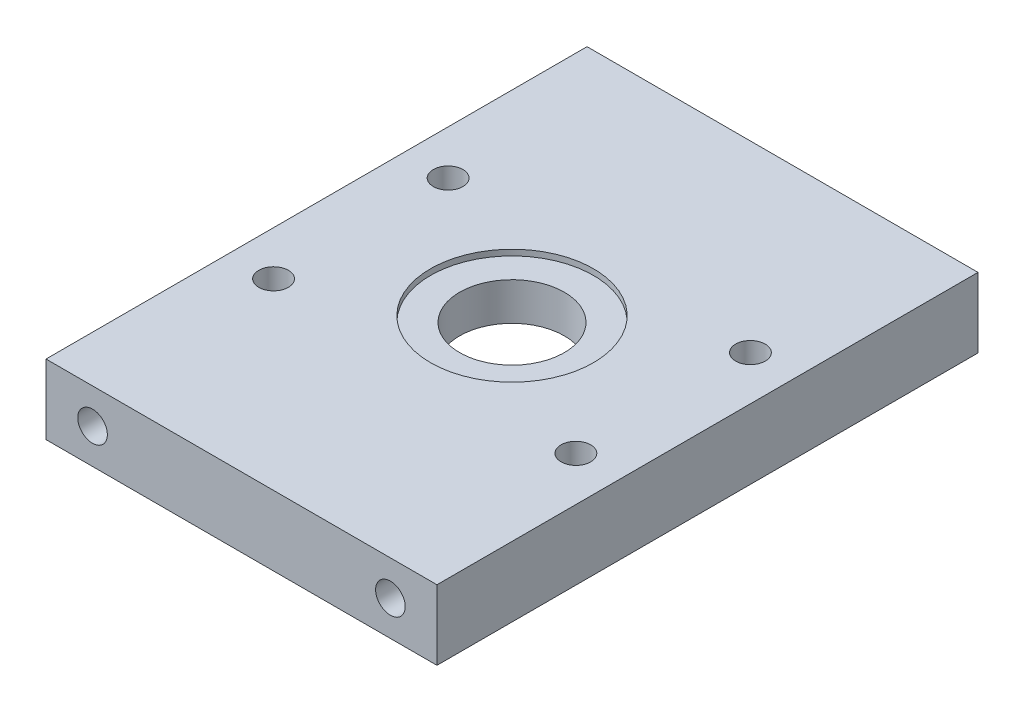
ISO-10303-21;
HEADER;
FILE_DESCRIPTION(('STEP AP214'),'2;1');
FILE_NAME('part.step','',(''),(''),'','','');
FILE_SCHEMA(('AUTOMOTIVE_DESIGN { 1 0 10303 214 1 1 1 1 }'));
ENDSEC;
DATA;
#1=APPLICATION_CONTEXT('core data for automotive mechanical design processes');
#2=APPLICATION_PROTOCOL_DEFINITION('international standard','automotive_design',2000,#1);
#3=PRODUCT_CONTEXT('',#1,'mechanical');
#4=PRODUCT('Part','Part','',(#3));
#5=PRODUCT_RELATED_PRODUCT_CATEGORY('part','',(#4));
#6=PRODUCT_DEFINITION_FORMATION('','',#4);
#7=PRODUCT_DEFINITION_CONTEXT('part definition',#1,'design');
#8=PRODUCT_DEFINITION('design','',#6,#7);
#9=PRODUCT_DEFINITION_SHAPE('','',#8);
#10=(LENGTH_UNIT() NAMED_UNIT(*) SI_UNIT(.MILLI.,.METRE.));
#11=(NAMED_UNIT(*) PLANE_ANGLE_UNIT() SI_UNIT($,.RADIAN.));
#12=(NAMED_UNIT(*) SI_UNIT($,.STERADIAN.) SOLID_ANGLE_UNIT());
#13=UNCERTAINTY_MEASURE_WITH_UNIT(LENGTH_MEASURE(1.E-05),#10,'distance_accuracy_value','');
#14=(GEOMETRIC_REPRESENTATION_CONTEXT(3) GLOBAL_UNCERTAINTY_ASSIGNED_CONTEXT((#13)) GLOBAL_UNIT_ASSIGNED_CONTEXT((#10,
#11,#12)) REPRESENTATION_CONTEXT('',''));
#15=CARTESIAN_POINT('',(0.,0.,0.));
#16=DIRECTION('',(0.,0.,1.));
#17=DIRECTION('',(1.,0.,0.));
#18=AXIS2_PLACEMENT_3D('',#15,#16,#17);
#19=CARTESIAN_POINT('',(-26.67,9.525,36.908347316));
#20=DIRECTION('',(0.,0.,-1.));
#21=DIRECTION('',(-1.,0.,0.));
#22=AXIS2_PLACEMENT_3D('',#19,#20,#21);
#23=PLANE('',#22);
#24=CARTESIAN_POINT('',(-20.32,4.7625,36.908347316));
#25=DIRECTION('',(0.,0.,1.));
#26=DIRECTION('',(1.,0.,0.));
#27=AXIS2_PLACEMENT_3D('',#24,#25,#26);
#28=CIRCLE('',#27,2.01929999999999);
#29=CARTESIAN_POINT('',(-18.3007,4.7625,36.908347316));
#30=VERTEX_POINT('',#29);
#31=EDGE_CURVE('E121',#30,#30,#28,.T.);
#32=ORIENTED_EDGE('',*,*,#31,.F.);
#33=EDGE_LOOP('',(#32));
#34=FACE_BOUND('',#33,.T.);
#35=DIRECTION('',(1.,0.,0.));
#36=VECTOR('',#35,1.);
#37=CARTESIAN_POINT('',(-26.67,0.,36.908347316));
#38=LINE('',#37,#36);
#39=CARTESIAN_POINT('',(-26.67,0.,36.908347316));
#40=VERTEX_POINT('',#39);
#41=CARTESIAN_POINT('',(26.67,0.,36.908347316));
#42=VERTEX_POINT('',#41);
#43=EDGE_CURVE('E78',#40,#42,#38,.T.);
#44=ORIENTED_EDGE('',*,*,#43,.T.);
#45=DIRECTION('',(0.,-1.,0.));
#46=VECTOR('',#45,1.);
#47=CARTESIAN_POINT('',(26.67,9.525,36.908347316));
#48=LINE('',#47,#46);
#49=CARTESIAN_POINT('',(26.67,9.525,36.908347316));
#50=VERTEX_POINT('',#49);
#51=EDGE_CURVE('E152',#50,#42,#48,.T.);
#52=ORIENTED_EDGE('',*,*,#51,.F.);
#53=DIRECTION('',(1.,0.,0.));
#54=VECTOR('',#53,1.);
#55=CARTESIAN_POINT('',(-26.67,9.525,36.908347316));
#56=LINE('',#55,#54);
#57=CARTESIAN_POINT('',(-26.67,9.525,36.908347316));
#58=VERTEX_POINT('',#57);
#59=EDGE_CURVE('E54',#58,#50,#56,.T.);
#60=ORIENTED_EDGE('',*,*,#59,.F.);
#61=DIRECTION('',(0.,-1.,0.));
#62=VECTOR('',#61,1.);
#63=CARTESIAN_POINT('',(-26.67,9.525,36.908347316));
#64=LINE('',#63,#62);
#65=EDGE_CURVE('E161',#58,#40,#64,.T.);
#66=ORIENTED_EDGE('',*,*,#65,.T.);
#67=EDGE_LOOP('',(#44,#52,#60,#66));
#68=FACE_BOUND('',#67,.T.);
#69=CARTESIAN_POINT('',(20.32,4.7625,36.908347316));
#70=DIRECTION('',(0.,0.,1.));
#71=DIRECTION('',(1.,0.,0.));
#72=AXIS2_PLACEMENT_3D('',#69,#70,#71);
#73=CIRCLE('',#72,2.01929999999999);
#74=CARTESIAN_POINT('',(22.3393,4.7625,36.908347316));
#75=VERTEX_POINT('',#74);
#76=EDGE_CURVE('E127',#75,#75,#73,.T.);
#77=ORIENTED_EDGE('',*,*,#76,.F.);
#78=EDGE_LOOP('',(#77));
#79=FACE_BOUND('',#78,.T.);
#80=ADVANCED_FACE('F35',(#34,#68,#79),#23,.F.);
#81=CARTESIAN_POINT('',(0.,9.525,0.));
#82=DIRECTION('',(0.,-1.,0.));
#83=DIRECTION('',(0.,0.,-1.));
#84=AXIS2_PLACEMENT_3D('',#81,#82,#83);
#85=CYLINDRICAL_SURFACE('',#84,7.14375);
#86=CARTESIAN_POINT('',(0.,8.73125,0.));
#87=DIRECTION('',(0.,1.,0.));
#88=DIRECTION('',(0.,0.,1.));
#89=AXIS2_PLACEMENT_3D('',#86,#87,#88);
#90=CIRCLE('',#89,7.14375);
#91=CARTESIAN_POINT('',(0.,8.73125,-7.14375));
#92=VERTEX_POINT('',#91);
#93=EDGE_CURVE('E142',#92,#92,#90,.T.);
#94=CARTESIAN_POINT('',(0.,3.571875,0.));
#95=DIRECTION('',(0.,-1.,0.));
#96=DIRECTION('',(0.,0.,-1.));
#97=AXIS2_PLACEMENT_3D('',#94,#95,#96);
#98=CIRCLE('',#97,7.14375);
#99=CARTESIAN_POINT('',(0.,3.571875,-7.14375));
#100=VERTEX_POINT('',#99);
#101=EDGE_CURVE('E39',#100,#100,#98,.T.);
#102=CARTESIAN_POINT('',(0.,8.73125,-7.14375));
#103=CARTESIAN_POINT('',(0.,8.67750651041667,-7.14375));
#104=CARTESIAN_POINT('',(0.,8.62376302083334,-7.14375));
#105=CARTESIAN_POINT('',(0.,8.51627604166667,-7.14375));
#106=CARTESIAN_POINT('',(0.,8.46253255208333,-7.14375));
#107=CARTESIAN_POINT('',(0.,8.35504557291667,-7.14375));
#108=CARTESIAN_POINT('',(0.,8.30130208333333,-7.14375));
#109=CARTESIAN_POINT('',(0.,8.19381510416667,-7.14375));
#110=CARTESIAN_POINT('',(0.,8.14007161458333,-7.14375));
#111=CARTESIAN_POINT('',(0.,8.03258463541667,-7.14375));
#112=CARTESIAN_POINT('',(0.,7.97884114583333,-7.14375));
#113=CARTESIAN_POINT('',(0.,7.87135416666667,-7.14375));
#114=CARTESIAN_POINT('',(0.,7.81761067708333,-7.14375));
#115=CARTESIAN_POINT('',(0.,7.71012369791667,-7.14375));
#116=CARTESIAN_POINT('',(0.,7.65638020833333,-7.14375));
#117=CARTESIAN_POINT('',(0.,7.54889322916667,-7.14375));
#118=CARTESIAN_POINT('',(0.,7.49514973958333,-7.14375));
#119=CARTESIAN_POINT('',(0.,7.38766276041667,-7.14375));
#120=CARTESIAN_POINT('',(0.,7.33391927083333,-7.14375));
#121=CARTESIAN_POINT('',(0.,7.22643229166667,-7.14375));
#122=CARTESIAN_POINT('',(0.,7.17268880208333,-7.14375));
#123=CARTESIAN_POINT('',(0.,7.06520182291667,-7.14375));
#124=CARTESIAN_POINT('',(0.,7.01145833333333,-7.14375));
#125=CARTESIAN_POINT('',(0.,6.90397135416667,-7.14375));
#126=CARTESIAN_POINT('',(0.,6.85022786458333,-7.14375));
#127=CARTESIAN_POINT('',(0.,6.74274088541667,-7.14375));
#128=CARTESIAN_POINT('',(0.,6.68899739583333,-7.14375));
#129=CARTESIAN_POINT('',(0.,6.58151041666667,-7.14375));
#130=CARTESIAN_POINT('',(0.,6.52776692708333,-7.14375));
#131=CARTESIAN_POINT('',(0.,6.42027994791667,-7.14375));
#132=CARTESIAN_POINT('',(0.,6.36653645833333,-7.14375));
#133=CARTESIAN_POINT('',(0.,6.25904947916667,-7.14375));
#134=CARTESIAN_POINT('',(0.,6.20530598958333,-7.14375));
#135=CARTESIAN_POINT('',(0.,6.09781901041667,-7.14375));
#136=CARTESIAN_POINT('',(0.,6.04407552083333,-7.14375));
#137=CARTESIAN_POINT('',(0.,5.93658854166667,-7.14375));
#138=CARTESIAN_POINT('',(0.,5.88284505208333,-7.14375));
#139=CARTESIAN_POINT('',(0.,5.77535807291667,-7.14375));
#140=CARTESIAN_POINT('',(0.,5.72161458333333,-7.14375));
#141=CARTESIAN_POINT('',(0.,5.61412760416667,-7.14375));
#142=CARTESIAN_POINT('',(0.,5.56038411458333,-7.14375));
#143=CARTESIAN_POINT('',(0.,5.45289713541667,-7.14375));
#144=CARTESIAN_POINT('',(0.,5.39915364583334,-7.14375));
#145=CARTESIAN_POINT('',(0.,5.29166666666667,-7.14375));
#146=CARTESIAN_POINT('',(0.,5.23792317708333,-7.14375));
#147=CARTESIAN_POINT('',(0.,5.13043619791667,-7.14375));
#148=CARTESIAN_POINT('',(0.,5.07669270833333,-7.14375));
#149=CARTESIAN_POINT('',(0.,4.96920572916667,-7.14375));
#150=CARTESIAN_POINT('',(0.,4.91546223958333,-7.14375));
#151=CARTESIAN_POINT('',(0.,4.80797526041667,-7.14375));
#152=CARTESIAN_POINT('',(0.,4.75423177083333,-7.14375));
#153=CARTESIAN_POINT('',(0.,4.64674479166667,-7.14375));
#154=CARTESIAN_POINT('',(0.,4.59300130208333,-7.14375));
#155=CARTESIAN_POINT('',(0.,4.48551432291667,-7.14375));
#156=CARTESIAN_POINT('',(0.,4.43177083333333,-7.14375));
#157=CARTESIAN_POINT('',(0.,4.32428385416667,-7.14375));
#158=CARTESIAN_POINT('',(0.,4.27054036458333,-7.14375));
#159=CARTESIAN_POINT('',(0.,4.16305338541667,-7.14375));
#160=CARTESIAN_POINT('',(0.,4.10930989583334,-7.14375));
#161=CARTESIAN_POINT('',(0.,4.00182291666667,-7.14375));
#162=CARTESIAN_POINT('',(0.,3.94807942708333,-7.14375));
#163=CARTESIAN_POINT('',(0.,3.84059244791667,-7.14375));
#164=CARTESIAN_POINT('',(0.,3.78684895833333,-7.14375));
#165=CARTESIAN_POINT('',(0.,3.67936197916667,-7.14375));
#166=CARTESIAN_POINT('',(0.,3.62561848958333,-7.14375));
#167=CARTESIAN_POINT('',(0.,3.571875,-7.14375));
#168=B_SPLINE_CURVE_WITH_KNOTS('',3,(#102,#103,#104,#105,#106,#107,#108,#109,#110,#111,#112,
#113,#114,#115,#116,#117,#118,#119,#120,#121,#122,#123,#124,#125,#126,#127,#128,#129,#130,#131,
#132,#133,#134,#135,#136,#137,#138,#139,#140,#141,#142,#143,#144,#145,#146,#147,#148,#149,#150,
#151,#152,#153,#154,#155,#156,#157,#158,#159,#160,#161,#162,#163,#164,#165,#166,#167),
.UNSPECIFIED.,.F.,.F.,(4,2,2,2,2,2,2,2,2,2,2,2,2,2,2,2,2,2,2,2,2,2,2,2,2,2,2,2,2,2,2,2,4),(0.,
0.161230468750001,0.322460937500001,0.48369140625,0.644921875000001,0.80615234375,
0.967382812500001,1.12861328125,1.28984375,1.45107421875,1.6123046875,1.77353515625,1.934765625,
2.09599609375,2.2572265625,2.41845703125,2.5796875,2.74091796875,2.9021484375,3.06337890625,
3.224609375,3.38583984375,3.5470703125,3.70830078125,3.86953125,4.03076171875,4.1919921875,
4.35322265625,4.514453125,4.67568359375,4.8369140625,4.99814453125,5.159375),.UNSPECIFIED.);
#169=EDGE_CURVE('BSEAM166',#92,#100,#168,.T.);
#170=ORIENTED_EDGE('',*,*,#93,.T.);
#171=ORIENTED_EDGE('',*,*,#101,.T.);
#172=ORIENTED_EDGE('',*,*,#169,.T.);
#173=ORIENTED_EDGE('',*,*,#169,.F.);
#174=EDGE_LOOP('',(#170,#172,#171,#173));
#175=FACE_BOUND('',#174,.T.);
#176=ADVANCED_FACE('F166',(#175),#85,.F.);
#177=CARTESIAN_POINT('',(0.,9.525,0.));
#178=DIRECTION('',(0.,-1.,0.));
#179=DIRECTION('',(0.,0.,-1.));
#180=AXIS2_PLACEMENT_3D('',#177,#178,#179);
#181=PLANE('',#180);
#182=CARTESIAN_POINT('',(-20.6222299276169,9.525,-11.90625));
#183=DIRECTION('',(0.,1.,0.));
#184=DIRECTION('',(0.,0.,1.));
#185=AXIS2_PLACEMENT_3D('',#182,#183,#184);
#186=CIRCLE('',#185,2.01929999999999);
#187=CARTESIAN_POINT('',(-20.6222299276169,9.525,-9.88695000000001));
#188=VERTEX_POINT('',#187);
#189=EDGE_CURVE('E368',#188,#188,#186,.T.);
#190=ORIENTED_EDGE('',*,*,#189,.F.);
#191=EDGE_LOOP('',(#190));
#192=FACE_BOUND('',#191,.T.);
#193=CARTESIAN_POINT('',(-20.6222299276169,9.525,11.90625));
#194=DIRECTION('',(0.,1.,0.));
#195=DIRECTION('',(0.,0.,1.));
#196=AXIS2_PLACEMENT_3D('',#193,#194,#195);
#197=CIRCLE('',#196,2.01929999999999);
#198=CARTESIAN_POINT('',(-20.6222299276169,9.525,13.92555));
#199=VERTEX_POINT('',#198);
#200=EDGE_CURVE('E370',#199,#199,#197,.T.);
#201=ORIENTED_EDGE('',*,*,#200,.F.);
#202=EDGE_LOOP('',(#201));
#203=FACE_BOUND('',#202,.T.);
#204=CARTESIAN_POINT('',(20.6222299276169,9.525,11.90625));
#205=DIRECTION('',(0.,1.,0.));
#206=DIRECTION('',(0.,0.,1.));
#207=AXIS2_PLACEMENT_3D('',#204,#205,#206);
#208=CIRCLE('',#207,2.01929999999999);
#209=CARTESIAN_POINT('',(20.6222299276169,9.525,13.92555));
#210=VERTEX_POINT('',#209);
#211=EDGE_CURVE('E378',#210,#210,#208,.T.);
#212=ORIENTED_EDGE('',*,*,#211,.F.);
#213=EDGE_LOOP('',(#212));
#214=FACE_BOUND('',#213,.T.);
#215=CARTESIAN_POINT('',(20.6222299276169,9.525,-11.90625));
#216=DIRECTION('',(0.,1.,0.));
#217=DIRECTION('',(0.,0.,1.));
#218=AXIS2_PLACEMENT_3D('',#215,#216,#217);
#219=CIRCLE('',#218,2.01929999999999);
#220=CARTESIAN_POINT('',(20.6222299276169,9.525,-9.88695000000002));
#221=VERTEX_POINT('',#220);
#222=EDGE_CURVE('E384',#221,#221,#219,.T.);
#223=ORIENTED_EDGE('',*,*,#222,.F.);
#224=EDGE_LOOP('',(#223));
#225=FACE_BOUND('',#224,.T.);
#226=CARTESIAN_POINT('',(0.,9.525,0.));
#227=DIRECTION('',(0.,1.,0.));
#228=DIRECTION('',(0.,0.,1.));
#229=AXIS2_PLACEMENT_3D('',#226,#227,#228);
#230=CIRCLE('',#229,11.1125);
#231=CARTESIAN_POINT('',(0.,9.525,11.1125));
#232=VERTEX_POINT('',#231);
#233=EDGE_CURVE('E143',#232,#232,#230,.T.);
#234=ORIENTED_EDGE('',*,*,#233,.F.);
#235=EDGE_LOOP('',(#234));
#236=FACE_BOUND('',#235,.T.);
#237=DIRECTION('',(0.,0.,-1.));
#238=VECTOR('',#237,1.);
#239=CARTESIAN_POINT('',(26.67,9.525,36.908347316));
#240=LINE('',#239,#238);
#241=CARTESIAN_POINT('',(26.67,9.525,-36.908347316));
#242=VERTEX_POINT('',#241);
#243=EDGE_CURVE('E146',#50,#242,#240,.T.);
#244=ORIENTED_EDGE('',*,*,#243,.T.);
#245=DIRECTION('',(-1.,0.,0.));
#246=VECTOR('',#245,1.);
#247=CARTESIAN_POINT('',(-26.67,9.525,-36.908347316));
#248=LINE('',#247,#246);
#249=CARTESIAN_POINT('',(-26.67,9.525,-36.908347316));
#250=VERTEX_POINT('',#249);
#251=EDGE_CURVE('E85',#242,#250,#248,.T.);
#252=ORIENTED_EDGE('',*,*,#251,.T.);
#253=DIRECTION('',(0.,0.,1.));
#254=VECTOR('',#253,1.);
#255=CARTESIAN_POINT('',(-26.67,9.525,36.908347316));
#256=LINE('',#255,#254);
#257=EDGE_CURVE('E149',#250,#58,#256,.T.);
#258=ORIENTED_EDGE('',*,*,#257,.T.);
#259=ORIENTED_EDGE('',*,*,#59,.T.);
#260=EDGE_LOOP('',(#244,#252,#258,#259));
#261=FACE_BOUND('',#260,.T.);
#262=ADVANCED_FACE('F183',(#192,#203,#214,#225,#236,#261),#181,.F.);
#263=CARTESIAN_POINT('',(0.,0.,0.));
#264=DIRECTION('',(0.,-1.,0.));
#265=DIRECTION('',(0.,0.,-1.));
#266=AXIS2_PLACEMENT_3D('',#263,#264,#265);
#267=PLANE('',#266);
#268=CARTESIAN_POINT('',(-20.6222299276169,0.,-11.90625));
#269=DIRECTION('',(0.,1.,0.));
#270=DIRECTION('',(0.,0.,1.));
#271=AXIS2_PLACEMENT_3D('',#268,#269,#270);
#272=CIRCLE('',#271,2.0193);
#273=CARTESIAN_POINT('',(-20.6222299276169,0.,-9.88695));
#274=VERTEX_POINT('',#273);
#275=EDGE_CURVE('E365',#274,#274,#272,.T.);
#276=ORIENTED_EDGE('',*,*,#275,.T.);
#277=EDGE_LOOP('',(#276));
#278=FACE_BOUND('',#277,.T.);
#279=CARTESIAN_POINT('',(-20.6222299276169,0.,11.90625));
#280=DIRECTION('',(0.,1.,0.));
#281=DIRECTION('',(0.,0.,1.));
#282=AXIS2_PLACEMENT_3D('',#279,#280,#281);
#283=CIRCLE('',#282,2.0193);
#284=CARTESIAN_POINT('',(-20.6222299276169,0.,13.92555));
#285=VERTEX_POINT('',#284);
#286=EDGE_CURVE('E375',#285,#285,#283,.T.);
#287=ORIENTED_EDGE('',*,*,#286,.T.);
#288=EDGE_LOOP('',(#287));
#289=FACE_BOUND('',#288,.T.);
#290=CARTESIAN_POINT('',(20.6222299276169,0.,11.90625));
#291=DIRECTION('',(0.,1.,0.));
#292=DIRECTION('',(0.,0.,1.));
#293=AXIS2_PLACEMENT_3D('',#290,#291,#292);
#294=CIRCLE('',#293,2.0193);
#295=CARTESIAN_POINT('',(20.6222299276169,0.,13.92555));
#296=VERTEX_POINT('',#295);
#297=EDGE_CURVE('E381',#296,#296,#294,.T.);
#298=ORIENTED_EDGE('',*,*,#297,.T.);
#299=EDGE_LOOP('',(#298));
#300=FACE_BOUND('',#299,.T.);
#301=CARTESIAN_POINT('',(20.6222299276169,0.,-11.90625));
#302=DIRECTION('',(0.,1.,0.));
#303=DIRECTION('',(0.,0.,1.));
#304=AXIS2_PLACEMENT_3D('',#301,#302,#303);
#305=CIRCLE('',#304,2.0193);
#306=CARTESIAN_POINT('',(20.6222299276169,0.,-9.88695000000001));
#307=VERTEX_POINT('',#306);
#308=EDGE_CURVE('E115',#307,#307,#305,.T.);
#309=ORIENTED_EDGE('',*,*,#308,.T.);
#310=EDGE_LOOP('',(#309));
#311=FACE_BOUND('',#310,.T.);
#312=CARTESIAN_POINT('',(0.,0.,0.));
#313=DIRECTION('',(0.,-1.,0.));
#314=DIRECTION('',(0.,0.,-1.));
#315=AXIS2_PLACEMENT_3D('',#312,#313,#314);
#316=CIRCLE('',#315,12.7);
#317=CARTESIAN_POINT('',(0.,0.,-12.7));
#318=VERTEX_POINT('',#317);
#319=EDGE_CURVE('E133',#318,#318,#316,.T.);
#320=ORIENTED_EDGE('',*,*,#319,.F.);
#321=EDGE_LOOP('',(#320));
#322=FACE_BOUND('',#321,.T.);
#323=DIRECTION('',(0.,0.,-1.));
#324=VECTOR('',#323,1.);
#325=CARTESIAN_POINT('',(26.67,0.,36.908347316));
#326=LINE('',#325,#324);
#327=CARTESIAN_POINT('',(26.67,0.,-36.908347316));
#328=VERTEX_POINT('',#327);
#329=EDGE_CURVE('E153',#42,#328,#326,.T.);
#330=ORIENTED_EDGE('',*,*,#329,.F.);
#331=ORIENTED_EDGE('',*,*,#43,.F.);
#332=DIRECTION('',(0.,0.,1.));
#333=VECTOR('',#332,1.);
#334=CARTESIAN_POINT('',(-26.67,0.,36.908347316));
#335=LINE('',#334,#333);
#336=CARTESIAN_POINT('',(-26.67,0.,-36.908347316));
#337=VERTEX_POINT('',#336);
#338=EDGE_CURVE('E72',#337,#40,#335,.T.);
#339=ORIENTED_EDGE('',*,*,#338,.F.);
#340=DIRECTION('',(-1.,0.,0.));
#341=VECTOR('',#340,1.);
#342=CARTESIAN_POINT('',(-26.67,0.,-36.908347316));
#343=LINE('',#342,#341);
#344=EDGE_CURVE('E156',#328,#337,#343,.T.);
#345=ORIENTED_EDGE('',*,*,#344,.F.);
#346=EDGE_LOOP('',(#330,#331,#339,#345));
#347=FACE_BOUND('',#346,.T.);
#348=ADVANCED_FACE('F185',(#278,#289,#300,#311,#322,#347),#267,.T.);
#349=CARTESIAN_POINT('',(26.67,9.525,36.908347316));
#350=DIRECTION('',(-1.,0.,0.));
#351=DIRECTION('',(0.,0.,1.));
#352=AXIS2_PLACEMENT_3D('',#349,#350,#351);
#353=PLANE('',#352);
#354=ORIENTED_EDGE('',*,*,#329,.T.);
#355=DIRECTION('',(0.,-1.,0.));
#356=VECTOR('',#355,1.);
#357=CARTESIAN_POINT('',(26.67,9.525,-36.908347316));
#358=LINE('',#357,#356);
#359=EDGE_CURVE('E11',#242,#328,#358,.T.);
#360=ORIENTED_EDGE('',*,*,#359,.F.);
#361=ORIENTED_EDGE('',*,*,#243,.F.);
#362=ORIENTED_EDGE('',*,*,#51,.T.);
#363=EDGE_LOOP('',(#354,#360,#361,#362));
#364=FACE_BOUND('',#363,.T.);
#365=ADVANCED_FACE('F37',(#364),#353,.F.);
#366=CARTESIAN_POINT('',(-26.67,9.525,-36.908347316));
#367=DIRECTION('',(0.,0.,1.));
#368=DIRECTION('',(1.,0.,0.));
#369=AXIS2_PLACEMENT_3D('',#366,#367,#368);
#370=PLANE('',#369);
#371=CARTESIAN_POINT('',(-20.32,4.7625,-36.908347316));
#372=DIRECTION('',(0.,0.,-1.));
#373=DIRECTION('',(-1.,0.,0.));
#374=AXIS2_PLACEMENT_3D('',#371,#372,#373);
#375=CIRCLE('',#374,2.01929999999999);
#376=CARTESIAN_POINT('',(-22.3393,4.7625,-36.908347316));
#377=VERTEX_POINT('',#376);
#378=EDGE_CURVE('E109',#377,#377,#375,.T.);
#379=ORIENTED_EDGE('',*,*,#378,.F.);
#380=EDGE_LOOP('',(#379));
#381=FACE_BOUND('',#380,.T.);
#382=CARTESIAN_POINT('',(20.32,4.7625,-36.908347316));
#383=DIRECTION('',(0.,0.,-1.));
#384=DIRECTION('',(-1.,0.,0.));
#385=AXIS2_PLACEMENT_3D('',#382,#383,#384);
#386=CIRCLE('',#385,2.01929999999999);
#387=CARTESIAN_POINT('',(18.3007,4.7625,-36.908347316));
#388=VERTEX_POINT('',#387);
#389=EDGE_CURVE('E108',#388,#388,#386,.T.);
#390=ORIENTED_EDGE('',*,*,#389,.F.);
#391=EDGE_LOOP('',(#390));
#392=FACE_BOUND('',#391,.T.);
#393=ORIENTED_EDGE('',*,*,#344,.T.);
#394=DIRECTION('',(0.,-1.,0.));
#395=VECTOR('',#394,1.);
#396=CARTESIAN_POINT('',(-26.67,9.525,-36.908347316));
#397=LINE('',#396,#395);
#398=EDGE_CURVE('E45',#250,#337,#397,.T.);
#399=ORIENTED_EDGE('',*,*,#398,.F.);
#400=ORIENTED_EDGE('',*,*,#251,.F.);
#401=ORIENTED_EDGE('',*,*,#359,.T.);
#402=EDGE_LOOP('',(#393,#399,#400,#401));
#403=FACE_BOUND('',#402,.T.);
#404=ADVANCED_FACE('F192',(#381,#392,#403),#370,.F.);
#405=CARTESIAN_POINT('',(-26.67,9.525,36.908347316));
#406=DIRECTION('',(1.,0.,0.));
#407=DIRECTION('',(0.,0.,-1.));
#408=AXIS2_PLACEMENT_3D('',#405,#406,#407);
#409=PLANE('',#408);
#410=ORIENTED_EDGE('',*,*,#338,.T.);
#411=ORIENTED_EDGE('',*,*,#65,.F.);
#412=ORIENTED_EDGE('',*,*,#257,.F.);
#413=ORIENTED_EDGE('',*,*,#398,.T.);
#414=EDGE_LOOP('',(#410,#411,#412,#413));
#415=FACE_BOUND('',#414,.T.);
#416=ADVANCED_FACE('F179',(#415),#409,.F.);
#417=CARTESIAN_POINT('',(0.,8.73125,0.));
#418=DIRECTION('',(0.,1.,0.));
#419=DIRECTION('',(0.,0.,1.));
#420=AXIS2_PLACEMENT_3D('',#417,#418,#419);
#421=CYLINDRICAL_SURFACE('',#420,11.1125);
#422=CARTESIAN_POINT('',(0.,8.73125,0.));
#423=DIRECTION('',(0.,1.,0.));
#424=DIRECTION('',(0.,0.,1.));
#425=AXIS2_PLACEMENT_3D('',#422,#423,#424);
#426=CIRCLE('',#425,11.1125);
#427=CARTESIAN_POINT('',(0.,8.73125,11.1125));
#428=VERTEX_POINT('',#427);
#429=EDGE_CURVE('E139',#428,#428,#426,.T.);
#430=ORIENTED_EDGE('',*,*,#429,.F.);
#431=EDGE_LOOP('',(#430));
#432=FACE_BOUND('',#431,.T.);
#433=ORIENTED_EDGE('',*,*,#233,.T.);
#434=EDGE_LOOP('',(#433));
#435=FACE_BOUND('',#434,.T.);
#436=ADVANCED_FACE('F173',(#432,#435),#421,.F.);
#437=CARTESIAN_POINT('',(0.,8.73125,0.));
#438=DIRECTION('',(0.,1.,0.));
#439=DIRECTION('',(0.,0.,1.));
#440=AXIS2_PLACEMENT_3D('',#437,#438,#439);
#441=PLANE('',#440);
#442=ORIENTED_EDGE('',*,*,#93,.F.);
#443=EDGE_LOOP('',(#442));
#444=FACE_BOUND('',#443,.T.);
#445=ORIENTED_EDGE('',*,*,#429,.T.);
#446=EDGE_LOOP('',(#445));
#447=FACE_BOUND('',#446,.T.);
#448=ADVANCED_FACE('F169',(#444,#447),#441,.T.);
#449=CARTESIAN_POINT('',(0.,3.571875,0.));
#450=DIRECTION('',(0.,-1.,0.));
#451=DIRECTION('',(0.,0.,-1.));
#452=AXIS2_PLACEMENT_3D('',#449,#450,#451);
#453=CYLINDRICAL_SURFACE('',#452,12.7);
#454=CARTESIAN_POINT('',(0.,3.571875,0.));
#455=DIRECTION('',(0.,-1.,0.));
#456=DIRECTION('',(0.,0.,-1.));
#457=AXIS2_PLACEMENT_3D('',#454,#455,#456);
#458=CIRCLE('',#457,12.7);
#459=CARTESIAN_POINT('',(0.,3.571875,-12.7));
#460=VERTEX_POINT('',#459);
#461=EDGE_CURVE('E134',#460,#460,#458,.T.);
#462=ORIENTED_EDGE('',*,*,#461,.F.);
#463=EDGE_LOOP('',(#462));
#464=FACE_BOUND('',#463,.T.);
#465=ORIENTED_EDGE('',*,*,#319,.T.);
#466=EDGE_LOOP('',(#465));
#467=FACE_BOUND('',#466,.T.);
#468=ADVANCED_FACE('F172',(#464,#467),#453,.F.);
#469=CARTESIAN_POINT('',(0.,3.571875,0.));
#470=DIRECTION('',(0.,-1.,0.));
#471=DIRECTION('',(0.,0.,-1.));
#472=AXIS2_PLACEMENT_3D('',#469,#470,#471);
#473=PLANE('',#472);
#474=ORIENTED_EDGE('',*,*,#101,.F.);
#475=EDGE_LOOP('',(#474));
#476=FACE_BOUND('',#475,.T.);
#477=ORIENTED_EDGE('',*,*,#461,.T.);
#478=EDGE_LOOP('',(#477));
#479=FACE_BOUND('',#478,.T.);
#480=ADVANCED_FACE('F248',(#476,#479),#473,.T.);
#481=CARTESIAN_POINT('',(20.32,4.7625,30.558347316));
#482=DIRECTION('',(0.,0.,1.));
#483=DIRECTION('',(1.,0.,0.));
#484=AXIS2_PLACEMENT_3D('',#481,#482,#483);
#485=CONICAL_SURFACE('',#484,2.0193,1.02974425867665);
#486=CARTESIAN_POINT('',(20.32,4.7625,29.3450294679976));
#487=VERTEX_POINT('',#486);
#488=VERTEX_LOOP('',#487);
#489=FACE_BOUND('',#488,.T.);
#490=CARTESIAN_POINT('',(20.32,4.7625,30.558347316));
#491=DIRECTION('',(0.,0.,1.));
#492=DIRECTION('',(1.,0.,0.));
#493=AXIS2_PLACEMENT_3D('',#490,#491,#492);
#494=CIRCLE('',#493,2.0193);
#495=CARTESIAN_POINT('',(22.3393,4.7625,30.558347316));
#496=VERTEX_POINT('',#495);
#497=EDGE_CURVE('E130',#496,#496,#494,.T.);
#498=ORIENTED_EDGE('',*,*,#497,.T.);
#499=EDGE_LOOP('',(#498));
#500=FACE_BOUND('',#499,.T.);
#501=ADVANCED_FACE('F244',(#489,#500),#485,.F.);
#502=CARTESIAN_POINT('',(20.32,4.7625,36.908347316));
#503=DIRECTION('',(0.,0.,1.));
#504=DIRECTION('',(1.,0.,0.));
#505=AXIS2_PLACEMENT_3D('',#502,#503,#504);
#506=CYLINDRICAL_SURFACE('',#505,2.01929999999999);
#507=ORIENTED_EDGE('',*,*,#497,.F.);
#508=EDGE_LOOP('',(#507));
#509=FACE_BOUND('',#508,.T.);
#510=ORIENTED_EDGE('',*,*,#76,.T.);
#511=EDGE_LOOP('',(#510));
#512=FACE_BOUND('',#511,.T.);
#513=ADVANCED_FACE('F240',(#509,#512),#506,.F.);
#514=CARTESIAN_POINT('',(-20.32,4.7625,30.558347316));
#515=DIRECTION('',(0.,0.,1.));
#516=DIRECTION('',(1.,0.,0.));
#517=AXIS2_PLACEMENT_3D('',#514,#515,#516);
#518=CONICAL_SURFACE('',#517,2.0193,1.02974425867665);
#519=CARTESIAN_POINT('',(-20.32,4.7625,29.3450294679976));
#520=VERTEX_POINT('',#519);
#521=VERTEX_LOOP('',#520);
#522=FACE_BOUND('',#521,.T.);
#523=CARTESIAN_POINT('',(-20.32,4.7625,30.558347316));
#524=DIRECTION('',(0.,0.,1.));
#525=DIRECTION('',(1.,0.,0.));
#526=AXIS2_PLACEMENT_3D('',#523,#524,#525);
#527=CIRCLE('',#526,2.0193);
#528=CARTESIAN_POINT('',(-18.3007,4.7625,30.558347316));
#529=VERTEX_POINT('',#528);
#530=EDGE_CURVE('E124',#529,#529,#527,.T.);
#531=ORIENTED_EDGE('',*,*,#530,.T.);
#532=EDGE_LOOP('',(#531));
#533=FACE_BOUND('',#532,.T.);
#534=ADVANCED_FACE('F236',(#522,#533),#518,.F.);
#535=CARTESIAN_POINT('',(-20.32,4.7625,36.908347316));
#536=DIRECTION('',(0.,0.,1.));
#537=DIRECTION('',(1.,0.,0.));
#538=AXIS2_PLACEMENT_3D('',#535,#536,#537);
#539=CYLINDRICAL_SURFACE('',#538,2.01929999999999);
#540=ORIENTED_EDGE('',*,*,#530,.F.);
#541=EDGE_LOOP('',(#540));
#542=FACE_BOUND('',#541,.T.);
#543=ORIENTED_EDGE('',*,*,#31,.T.);
#544=EDGE_LOOP('',(#543));
#545=FACE_BOUND('',#544,.T.);
#546=ADVANCED_FACE('F228',(#542,#545),#539,.F.);
#547=CARTESIAN_POINT('',(20.32,4.7625,-30.558347316));
#548=DIRECTION('',(0.,0.,-1.));
#549=DIRECTION('',(-1.,0.,0.));
#550=AXIS2_PLACEMENT_3D('',#547,#548,#549);
#551=CONICAL_SURFACE('',#550,2.0193,1.02974425867665);
#552=CARTESIAN_POINT('',(20.32,4.7625,-29.3450294679976));
#553=VERTEX_POINT('',#552);
#554=VERTEX_LOOP('',#553);
#555=FACE_BOUND('',#554,.T.);
#556=CARTESIAN_POINT('',(20.32,4.7625,-30.558347316));
#557=DIRECTION('',(0.,0.,-1.));
#558=DIRECTION('',(-1.,0.,0.));
#559=AXIS2_PLACEMENT_3D('',#556,#557,#558);
#560=CIRCLE('',#559,2.0193);
#561=CARTESIAN_POINT('',(18.3007,4.7625,-30.558347316));
#562=VERTEX_POINT('',#561);
#563=EDGE_CURVE('E112',#562,#562,#560,.T.);
#564=ORIENTED_EDGE('',*,*,#563,.T.);
#565=EDGE_LOOP('',(#564));
#566=FACE_BOUND('',#565,.T.);
#567=ADVANCED_FACE('F222',(#555,#566),#551,.F.);
#568=CARTESIAN_POINT('',(20.32,4.7625,-36.908347316));
#569=DIRECTION('',(0.,0.,-1.));
#570=DIRECTION('',(-1.,0.,0.));
#571=AXIS2_PLACEMENT_3D('',#568,#569,#570);
#572=CYLINDRICAL_SURFACE('',#571,2.01929999999999);
#573=ORIENTED_EDGE('',*,*,#563,.F.);
#574=EDGE_LOOP('',(#573));
#575=FACE_BOUND('',#574,.T.);
#576=ORIENTED_EDGE('',*,*,#389,.T.);
#577=EDGE_LOOP('',(#576));
#578=FACE_BOUND('',#577,.T.);
#579=ADVANCED_FACE('F102',(#575,#578),#572,.F.);
#580=CARTESIAN_POINT('',(-20.32,4.7625,-30.558347316));
#581=DIRECTION('',(0.,0.,-1.));
#582=DIRECTION('',(-1.,0.,0.));
#583=AXIS2_PLACEMENT_3D('',#580,#581,#582);
#584=CONICAL_SURFACE('',#583,2.0193,1.02974425867665);
#585=CARTESIAN_POINT('',(-20.32,4.7625,-29.3450294679976));
#586=VERTEX_POINT('',#585);
#587=VERTEX_LOOP('',#586);
#588=FACE_BOUND('',#587,.T.);
#589=CARTESIAN_POINT('',(-20.32,4.7625,-30.558347316));
#590=DIRECTION('',(0.,0.,-1.));
#591=DIRECTION('',(-1.,0.,0.));
#592=AXIS2_PLACEMENT_3D('',#589,#590,#591);
#593=CIRCLE('',#592,2.0193);
#594=CARTESIAN_POINT('',(-22.3393,4.7625,-30.558347316));
#595=VERTEX_POINT('',#594);
#596=EDGE_CURVE('E106',#595,#595,#593,.T.);
#597=ORIENTED_EDGE('',*,*,#596,.T.);
#598=EDGE_LOOP('',(#597));
#599=FACE_BOUND('',#598,.T.);
#600=ADVANCED_FACE('F98',(#588,#599),#584,.F.);
#601=CARTESIAN_POINT('',(-20.32,4.7625,-36.908347316));
#602=DIRECTION('',(0.,0.,-1.));
#603=DIRECTION('',(-1.,0.,0.));
#604=AXIS2_PLACEMENT_3D('',#601,#602,#603);
#605=CYLINDRICAL_SURFACE('',#604,2.01929999999999);
#606=ORIENTED_EDGE('',*,*,#596,.F.);
#607=EDGE_LOOP('',(#606));
#608=FACE_BOUND('',#607,.T.);
#609=ORIENTED_EDGE('',*,*,#378,.T.);
#610=EDGE_LOOP('',(#609));
#611=FACE_BOUND('',#610,.T.);
#612=ADVANCED_FACE('F101',(#608,#611),#605,.F.);
#613=CARTESIAN_POINT('',(20.6222299276169,9.525,-11.90625));
#614=DIRECTION('',(0.,1.,0.));
#615=DIRECTION('',(0.,0.,1.));
#616=AXIS2_PLACEMENT_3D('',#613,#614,#615);
#617=CYLINDRICAL_SURFACE('',#616,2.01929999999999);
#618=ORIENTED_EDGE('',*,*,#308,.F.);
#619=EDGE_LOOP('',(#618));
#620=FACE_BOUND('',#619,.T.);
#621=ORIENTED_EDGE('',*,*,#222,.T.);
#622=EDGE_LOOP('',(#621));
#623=FACE_BOUND('',#622,.T.);
#624=ADVANCED_FACE('F310',(#620,#623),#617,.F.);
#625=CARTESIAN_POINT('',(20.6222299276169,9.525,11.90625));
#626=DIRECTION('',(0.,1.,0.));
#627=DIRECTION('',(0.,0.,1.));
#628=AXIS2_PLACEMENT_3D('',#625,#626,#627);
#629=CYLINDRICAL_SURFACE('',#628,2.01929999999999);
#630=ORIENTED_EDGE('',*,*,#297,.F.);
#631=EDGE_LOOP('',(#630));
#632=FACE_BOUND('',#631,.T.);
#633=ORIENTED_EDGE('',*,*,#211,.T.);
#634=EDGE_LOOP('',(#633));
#635=FACE_BOUND('',#634,.T.);
#636=ADVANCED_FACE('F329',(#632,#635),#629,.F.);
#637=CARTESIAN_POINT('',(-20.6222299276169,9.525,11.90625));
#638=DIRECTION('',(0.,1.,0.));
#639=DIRECTION('',(0.,0.,1.));
#640=AXIS2_PLACEMENT_3D('',#637,#638,#639);
#641=CYLINDRICAL_SURFACE('',#640,2.01929999999999);
#642=ORIENTED_EDGE('',*,*,#286,.F.);
#643=EDGE_LOOP('',(#642));
#644=FACE_BOUND('',#643,.T.);
#645=ORIENTED_EDGE('',*,*,#200,.T.);
#646=EDGE_LOOP('',(#645));
#647=FACE_BOUND('',#646,.T.);
#648=ADVANCED_FACE('F339',(#644,#647),#641,.F.);
#649=CARTESIAN_POINT('',(-20.6222299276169,9.525,-11.90625));
#650=DIRECTION('',(0.,1.,0.));
#651=DIRECTION('',(0.,0.,1.));
#652=AXIS2_PLACEMENT_3D('',#649,#650,#651);
#653=CYLINDRICAL_SURFACE('',#652,2.01929999999999);
#654=ORIENTED_EDGE('',*,*,#275,.F.);
#655=EDGE_LOOP('',(#654));
#656=FACE_BOUND('',#655,.T.);
#657=ORIENTED_EDGE('',*,*,#189,.T.);
#658=EDGE_LOOP('',(#657));
#659=FACE_BOUND('',#658,.T.);
#660=ADVANCED_FACE('F349',(#656,#659),#653,.F.);
#661=CLOSED_SHELL('',(#80,#176,#262,#348,#365,#404,#416,#436,#448,#468,#480,#501,#513,#534,#546,
#567,#579,#600,#612,#624,#636,#648,#660));
#662=MANIFOLD_SOLID_BREP('B2',#661);
#663=ADVANCED_BREP_SHAPE_REPRESENTATION('',(#18,#662),#14);
#664=SHAPE_DEFINITION_REPRESENTATION(#9,#663);
ENDSEC;
END-ISO-10303-21;
